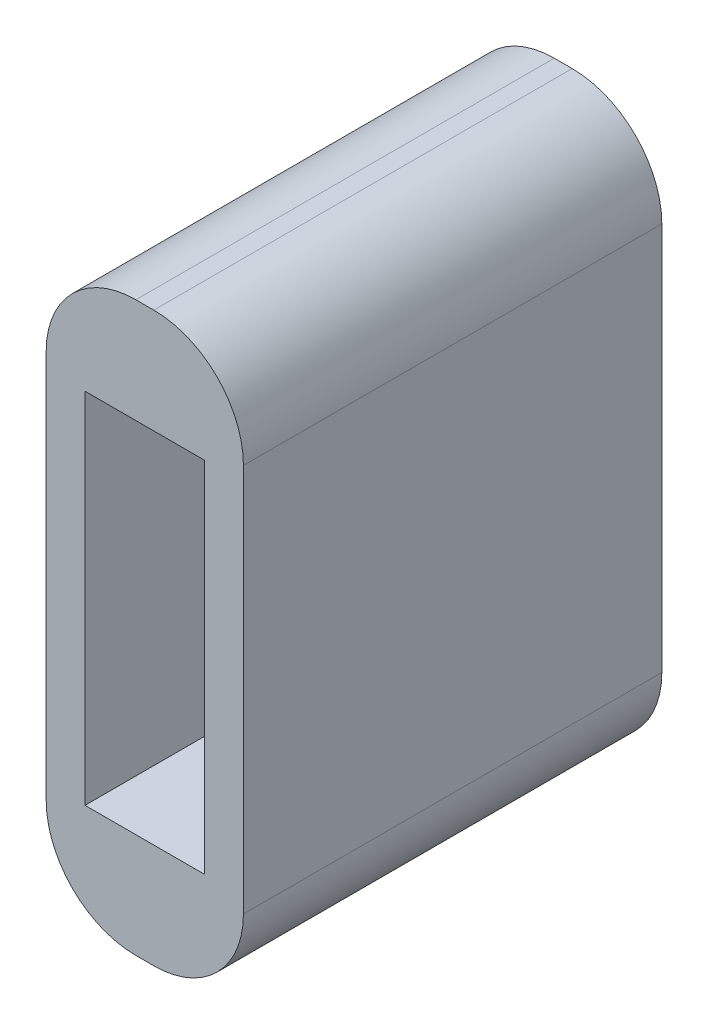
ISO-10303-21;
HEADER;
FILE_DESCRIPTION(('STEP AP214'),'2;1');
FILE_NAME('part.step','',(''),(''),'','','');
FILE_SCHEMA(('AUTOMOTIVE_DESIGN { 1 0 10303 214 1 1 1 1 }'));
ENDSEC;
DATA;
#1=APPLICATION_CONTEXT('core data for automotive mechanical design processes');
#2=APPLICATION_PROTOCOL_DEFINITION('international standard','automotive_design',2000,#1);
#3=PRODUCT_CONTEXT('',#1,'mechanical');
#4=PRODUCT('Part','Part','',(#3));
#5=PRODUCT_RELATED_PRODUCT_CATEGORY('part','',(#4));
#6=PRODUCT_DEFINITION_FORMATION('','',#4);
#7=PRODUCT_DEFINITION_CONTEXT('part definition',#1,'design');
#8=PRODUCT_DEFINITION('design','',#6,#7);
#9=PRODUCT_DEFINITION_SHAPE('','',#8);
#10=(LENGTH_UNIT() NAMED_UNIT(*) SI_UNIT(.MILLI.,.METRE.));
#11=(NAMED_UNIT(*) PLANE_ANGLE_UNIT() SI_UNIT($,.RADIAN.));
#12=(NAMED_UNIT(*) SI_UNIT($,.STERADIAN.) SOLID_ANGLE_UNIT());
#13=UNCERTAINTY_MEASURE_WITH_UNIT(LENGTH_MEASURE(1.E-05),#10,'distance_accuracy_value','');
#14=(GEOMETRIC_REPRESENTATION_CONTEXT(3) GLOBAL_UNCERTAINTY_ASSIGNED_CONTEXT((#13)) GLOBAL_UNIT_ASSIGNED_CONTEXT((#10,
#11,#12)) REPRESENTATION_CONTEXT('',''));
#15=CARTESIAN_POINT('',(0.,0.,0.));
#16=DIRECTION('',(0.,0.,1.));
#17=DIRECTION('',(1.,0.,0.));
#18=AXIS2_PLACEMENT_3D('',#15,#16,#17);
#19=CARTESIAN_POINT('',(1.65,4.75,7.));
#20=DIRECTION('',(-1.,0.,0.));
#21=DIRECTION('',(0.,0.,1.));
#22=AXIS2_PLACEMENT_3D('',#19,#20,#21);
#23=PLANE('',#22);
#24=DIRECTION('',(0.,1.,0.));
#25=VECTOR('',#24,1.);
#26=CARTESIAN_POINT('',(1.65,4.75,7.));
#27=LINE('',#26,#25);
#28=CARTESIAN_POINT('',(1.65,-3.25,7.));
#29=VERTEX_POINT('',#28);
#30=CARTESIAN_POINT('',(1.65,3.25,7.));
#31=VERTEX_POINT('',#30);
#32=EDGE_CURVE('E159',#29,#31,#27,.T.);
#33=ORIENTED_EDGE('',*,*,#32,.F.);
#34=DIRECTION('',(0.,0.,-1.));
#35=VECTOR('',#34,1.);
#36=CARTESIAN_POINT('',(1.65,-3.25,7.));
#37=LINE('',#36,#35);
#38=CARTESIAN_POINT('',(1.65,-3.25,0.));
#39=VERTEX_POINT('',#38);
#40=EDGE_CURVE('E184',#29,#39,#37,.T.);
#41=ORIENTED_EDGE('',*,*,#40,.T.);
#42=DIRECTION('',(0.,1.,0.));
#43=VECTOR('',#42,1.);
#44=CARTESIAN_POINT('',(1.65,4.75,0.));
#45=LINE('',#44,#43);
#46=CARTESIAN_POINT('',(1.65,3.25,0.));
#47=VERTEX_POINT('',#46);
#48=EDGE_CURVE('E155',#39,#47,#45,.T.);
#49=ORIENTED_EDGE('',*,*,#48,.T.);
#50=DIRECTION('',(0.,0.,-1.));
#51=VECTOR('',#50,1.);
#52=CARTESIAN_POINT('',(1.65,3.25,7.));
#53=LINE('',#52,#51);
#54=EDGE_CURVE('E172',#47,#31,#53,.F.);
#55=ORIENTED_EDGE('',*,*,#54,.T.);
#56=EDGE_LOOP('',(#33,#41,#49,#55));
#57=FACE_BOUND('',#56,.T.);
#58=ADVANCED_FACE('F34',(#57),#23,.F.);
#59=CARTESIAN_POINT('',(-1.65,4.75,7.));
#60=DIRECTION('',(0.,-1.,0.));
#61=DIRECTION('',(0.,0.,-1.));
#62=AXIS2_PLACEMENT_3D('',#59,#60,#61);
#63=PLANE('',#62);
#64=DIRECTION('',(-1.,0.,0.));
#65=VECTOR('',#64,1.);
#66=CARTESIAN_POINT('',(-1.65,4.75,0.));
#67=LINE('',#66,#65);
#68=CARTESIAN_POINT('',(0.150000000000001,4.75,0.));
#69=VERTEX_POINT('',#68);
#70=CARTESIAN_POINT('',(-0.150000000000001,4.75,0.));
#71=VERTEX_POINT('',#70);
#72=EDGE_CURVE('E175',#69,#71,#67,.T.);
#73=ORIENTED_EDGE('',*,*,#72,.T.);
#74=DIRECTION('',(0.,0.,-1.));
#75=VECTOR('',#74,1.);
#76=CARTESIAN_POINT('',(-0.150000000000001,4.75,7.));
#77=LINE('',#76,#75);
#78=CARTESIAN_POINT('',(-0.150000000000001,4.75,7.));
#79=VERTEX_POINT('',#78);
#80=EDGE_CURVE('E11',#71,#79,#77,.F.);
#81=ORIENTED_EDGE('',*,*,#80,.T.);
#82=DIRECTION('',(-1.,0.,0.));
#83=VECTOR('',#82,1.);
#84=CARTESIAN_POINT('',(-1.65,4.75,7.));
#85=LINE('',#84,#83);
#86=CARTESIAN_POINT('',(0.150000000000001,4.75,7.));
#87=VERTEX_POINT('',#86);
#88=EDGE_CURVE('E162',#87,#79,#85,.T.);
#89=ORIENTED_EDGE('',*,*,#88,.F.);
#90=DIRECTION('',(0.,0.,-1.));
#91=VECTOR('',#90,1.);
#92=CARTESIAN_POINT('',(0.150000000000001,4.75,7.));
#93=LINE('',#92,#91);
#94=EDGE_CURVE('E42',#87,#69,#93,.T.);
#95=ORIENTED_EDGE('',*,*,#94,.T.);
#96=EDGE_LOOP('',(#73,#81,#89,#95));
#97=FACE_BOUND('',#96,.T.);
#98=ADVANCED_FACE('F217',(#97),#63,.F.);
#99=CARTESIAN_POINT('',(-1.65,4.75,7.));
#100=DIRECTION('',(1.,0.,0.));
#101=DIRECTION('',(0.,0.,-1.));
#102=AXIS2_PLACEMENT_3D('',#99,#100,#101);
#103=PLANE('',#102);
#104=DIRECTION('',(0.,-1.,0.));
#105=VECTOR('',#104,1.);
#106=CARTESIAN_POINT('',(-1.65,4.75,0.));
#107=LINE('',#106,#105);
#108=CARTESIAN_POINT('',(-1.65,3.25,0.));
#109=VERTEX_POINT('',#108);
#110=CARTESIAN_POINT('',(-1.65,-3.25,0.));
#111=VERTEX_POINT('',#110);
#112=EDGE_CURVE('E178',#109,#111,#107,.T.);
#113=ORIENTED_EDGE('',*,*,#112,.T.);
#114=DIRECTION('',(0.,0.,-1.));
#115=VECTOR('',#114,1.);
#116=CARTESIAN_POINT('',(-1.65,-3.25,7.));
#117=LINE('',#116,#115);
#118=CARTESIAN_POINT('',(-1.65,-3.25,7.));
#119=VERTEX_POINT('',#118);
#120=EDGE_CURVE('E211',#111,#119,#117,.F.);
#121=ORIENTED_EDGE('',*,*,#120,.T.);
#122=DIRECTION('',(0.,-1.,0.));
#123=VECTOR('',#122,1.);
#124=CARTESIAN_POINT('',(-1.65,4.75,7.));
#125=LINE('',#124,#123);
#126=CARTESIAN_POINT('',(-1.65,3.25,7.));
#127=VERTEX_POINT('',#126);
#128=EDGE_CURVE('E166',#127,#119,#125,.T.);
#129=ORIENTED_EDGE('',*,*,#128,.F.);
#130=DIRECTION('',(0.,0.,-1.));
#131=VECTOR('',#130,1.);
#132=CARTESIAN_POINT('',(-1.65,3.25,7.));
#133=LINE('',#132,#131);
#134=EDGE_CURVE('E208',#127,#109,#133,.T.);
#135=ORIENTED_EDGE('',*,*,#134,.T.);
#136=EDGE_LOOP('',(#113,#121,#129,#135));
#137=FACE_BOUND('',#136,.T.);
#138=ADVANCED_FACE('F229',(#137),#103,.F.);
#139=CARTESIAN_POINT('',(-1.65,-4.75,7.));
#140=DIRECTION('',(0.,1.,0.));
#141=DIRECTION('',(0.,0.,1.));
#142=AXIS2_PLACEMENT_3D('',#139,#140,#141);
#143=PLANE('',#142);
#144=DIRECTION('',(1.,0.,0.));
#145=VECTOR('',#144,1.);
#146=CARTESIAN_POINT('',(-1.65,-4.75,0.));
#147=LINE('',#146,#145);
#148=CARTESIAN_POINT('',(-0.150000000000001,-4.75,0.));
#149=VERTEX_POINT('',#148);
#150=CARTESIAN_POINT('',(0.150000000000001,-4.75,0.));
#151=VERTEX_POINT('',#150);
#152=EDGE_CURVE('E163',#149,#151,#147,.T.);
#153=ORIENTED_EDGE('',*,*,#152,.T.);
#154=DIRECTION('',(0.,0.,-1.));
#155=VECTOR('',#154,1.);
#156=CARTESIAN_POINT('',(0.150000000000001,-4.75,7.));
#157=LINE('',#156,#155);
#158=CARTESIAN_POINT('',(0.150000000000001,-4.75,7.));
#159=VERTEX_POINT('',#158);
#160=EDGE_CURVE('E198',#151,#159,#157,.F.);
#161=ORIENTED_EDGE('',*,*,#160,.T.);
#162=DIRECTION('',(1.,0.,0.));
#163=VECTOR('',#162,1.);
#164=CARTESIAN_POINT('',(-1.65,-4.75,7.));
#165=LINE('',#164,#163);
#166=CARTESIAN_POINT('',(-0.150000000000001,-4.75,7.));
#167=VERTEX_POINT('',#166);
#168=EDGE_CURVE('E169',#167,#159,#165,.T.);
#169=ORIENTED_EDGE('',*,*,#168,.F.);
#170=DIRECTION('',(0.,0.,-1.));
#171=VECTOR('',#170,1.);
#172=CARTESIAN_POINT('',(-0.150000000000001,-4.75,7.));
#173=LINE('',#172,#171);
#174=EDGE_CURVE('E195',#167,#149,#173,.T.);
#175=ORIENTED_EDGE('',*,*,#174,.T.);
#176=EDGE_LOOP('',(#153,#161,#169,#175));
#177=FACE_BOUND('',#176,.T.);
#178=ADVANCED_FACE('F240',(#177),#143,.F.);
#179=CARTESIAN_POINT('',(0.,0.,7.));
#180=DIRECTION('',(0.,0.,1.));
#181=DIRECTION('',(1.,0.,0.));
#182=AXIS2_PLACEMENT_3D('',#179,#180,#181);
#183=PLANE('',#182);
#184=DIRECTION('',(0.,1.,0.));
#185=VECTOR('',#184,1.);
#186=CARTESIAN_POINT('',(1.,3.,7.));
#187=LINE('',#186,#185);
#188=CARTESIAN_POINT('',(1.,-3.,7.));
#189=VERTEX_POINT('',#188);
#190=CARTESIAN_POINT('',(1.,3.,7.));
#191=VERTEX_POINT('',#190);
#192=EDGE_CURVE('E49',#189,#191,#187,.T.);
#193=ORIENTED_EDGE('',*,*,#192,.F.);
#194=DIRECTION('',(1.,0.,0.));
#195=VECTOR('',#194,1.);
#196=CARTESIAN_POINT('',(-1.,-3.,7.));
#197=LINE('',#196,#195);
#198=CARTESIAN_POINT('',(-1.,-3.,7.));
#199=VERTEX_POINT('',#198);
#200=EDGE_CURVE('E140',#199,#189,#197,.T.);
#201=ORIENTED_EDGE('',*,*,#200,.F.);
#202=DIRECTION('',(0.,-1.,0.));
#203=VECTOR('',#202,1.);
#204=CARTESIAN_POINT('',(-1.,3.,7.));
#205=LINE('',#204,#203);
#206=CARTESIAN_POINT('',(-1.,3.,7.));
#207=VERTEX_POINT('',#206);
#208=EDGE_CURVE('E143',#207,#199,#205,.T.);
#209=ORIENTED_EDGE('',*,*,#208,.F.);
#210=DIRECTION('',(-1.,0.,0.));
#211=VECTOR('',#210,1.);
#212=CARTESIAN_POINT('',(-1.,3.,7.));
#213=LINE('',#212,#211);
#214=EDGE_CURVE('E149',#191,#207,#213,.T.);
#215=ORIENTED_EDGE('',*,*,#214,.F.);
#216=EDGE_LOOP('',(#193,#201,#209,#215));
#217=FACE_BOUND('',#216,.T.);
#218=ORIENTED_EDGE('',*,*,#168,.T.);
#219=CARTESIAN_POINT('',(0.150000000000001,-3.25,7.));
#220=DIRECTION('',(0.,0.,1.));
#221=DIRECTION('',(1.,0.,0.));
#222=AXIS2_PLACEMENT_3D('',#219,#220,#221);
#223=CIRCLE('',#222,1.5);
#224=EDGE_CURVE('E206',#159,#29,#223,.T.);
#225=ORIENTED_EDGE('',*,*,#224,.T.);
#226=ORIENTED_EDGE('',*,*,#32,.T.);
#227=CARTESIAN_POINT('',(0.150000000000001,3.25,7.));
#228=DIRECTION('',(0.,0.,1.));
#229=DIRECTION('',(1.,0.,0.));
#230=AXIS2_PLACEMENT_3D('',#227,#228,#229);
#231=CIRCLE('',#230,1.5);
#232=EDGE_CURVE('E200',#31,#87,#231,.T.);
#233=ORIENTED_EDGE('',*,*,#232,.T.);
#234=ORIENTED_EDGE('',*,*,#88,.T.);
#235=CARTESIAN_POINT('',(-0.150000000000001,3.25,7.));
#236=DIRECTION('',(0.,0.,1.));
#237=DIRECTION('',(1.,0.,0.));
#238=AXIS2_PLACEMENT_3D('',#235,#236,#237);
#239=CIRCLE('',#238,1.5);
#240=EDGE_CURVE('E202',#79,#127,#239,.T.);
#241=ORIENTED_EDGE('',*,*,#240,.T.);
#242=ORIENTED_EDGE('',*,*,#128,.T.);
#243=CARTESIAN_POINT('',(-0.150000000000001,-3.25,7.));
#244=DIRECTION('',(0.,0.,1.));
#245=DIRECTION('',(1.,0.,0.));
#246=AXIS2_PLACEMENT_3D('',#243,#244,#245);
#247=CIRCLE('',#246,1.5);
#248=EDGE_CURVE('E204',#119,#167,#247,.T.);
#249=ORIENTED_EDGE('',*,*,#248,.T.);
#250=EDGE_LOOP('',(#218,#225,#226,#233,#234,#241,#242,#249));
#251=FACE_BOUND('',#250,.T.);
#252=ADVANCED_FACE('F233',(#217,#251),#183,.T.);
#253=CARTESIAN_POINT('',(0.,0.,0.));
#254=DIRECTION('',(0.,0.,1.));
#255=DIRECTION('',(1.,0.,0.));
#256=AXIS2_PLACEMENT_3D('',#253,#254,#255);
#257=PLANE('',#256);
#258=DIRECTION('',(1.,0.,0.));
#259=VECTOR('',#258,1.);
#260=CARTESIAN_POINT('',(-1.,-3.,0.));
#261=LINE('',#260,#259);
#262=CARTESIAN_POINT('',(-1.,-3.,0.));
#263=VERTEX_POINT('',#262);
#264=CARTESIAN_POINT('',(1.,-3.,0.));
#265=VERTEX_POINT('',#264);
#266=EDGE_CURVE('E130',#263,#265,#261,.T.);
#267=ORIENTED_EDGE('',*,*,#266,.T.);
#268=DIRECTION('',(0.,1.,0.));
#269=VECTOR('',#268,1.);
#270=CARTESIAN_POINT('',(1.,3.,0.));
#271=LINE('',#270,#269);
#272=CARTESIAN_POINT('',(1.,3.,0.));
#273=VERTEX_POINT('',#272);
#274=EDGE_CURVE('E124',#265,#273,#271,.T.);
#275=ORIENTED_EDGE('',*,*,#274,.T.);
#276=DIRECTION('',(-1.,0.,0.));
#277=VECTOR('',#276,1.);
#278=CARTESIAN_POINT('',(-1.,3.,0.));
#279=LINE('',#278,#277);
#280=CARTESIAN_POINT('',(-1.,3.,0.));
#281=VERTEX_POINT('',#280);
#282=EDGE_CURVE('E133',#273,#281,#279,.T.);
#283=ORIENTED_EDGE('',*,*,#282,.T.);
#284=DIRECTION('',(0.,-1.,0.));
#285=VECTOR('',#284,1.);
#286=CARTESIAN_POINT('',(-1.,3.,0.));
#287=LINE('',#286,#285);
#288=EDGE_CURVE('E57',#281,#263,#287,.T.);
#289=ORIENTED_EDGE('',*,*,#288,.T.);
#290=EDGE_LOOP('',(#267,#275,#283,#289));
#291=FACE_BOUND('',#290,.T.);
#292=ORIENTED_EDGE('',*,*,#48,.F.);
#293=CARTESIAN_POINT('',(0.150000000000001,-3.25,0.));
#294=DIRECTION('',(0.,0.,1.));
#295=DIRECTION('',(1.,0.,0.));
#296=AXIS2_PLACEMENT_3D('',#293,#294,#295);
#297=CIRCLE('',#296,1.5);
#298=EDGE_CURVE('E193',#39,#151,#297,.F.);
#299=ORIENTED_EDGE('',*,*,#298,.T.);
#300=ORIENTED_EDGE('',*,*,#152,.F.);
#301=CARTESIAN_POINT('',(-0.150000000000001,-3.25,0.));
#302=DIRECTION('',(0.,0.,1.));
#303=DIRECTION('',(1.,0.,0.));
#304=AXIS2_PLACEMENT_3D('',#301,#302,#303);
#305=CIRCLE('',#304,1.5);
#306=EDGE_CURVE('E191',#149,#111,#305,.F.);
#307=ORIENTED_EDGE('',*,*,#306,.T.);
#308=ORIENTED_EDGE('',*,*,#112,.F.);
#309=CARTESIAN_POINT('',(-0.150000000000001,3.25,0.));
#310=DIRECTION('',(0.,0.,1.));
#311=DIRECTION('',(1.,0.,0.));
#312=AXIS2_PLACEMENT_3D('',#309,#310,#311);
#313=CIRCLE('',#312,1.5);
#314=EDGE_CURVE('E189',#109,#71,#313,.F.);
#315=ORIENTED_EDGE('',*,*,#314,.T.);
#316=ORIENTED_EDGE('',*,*,#72,.F.);
#317=CARTESIAN_POINT('',(0.150000000000001,3.25,0.));
#318=DIRECTION('',(0.,0.,1.));
#319=DIRECTION('',(1.,0.,0.));
#320=AXIS2_PLACEMENT_3D('',#317,#318,#319);
#321=CIRCLE('',#320,1.5);
#322=EDGE_CURVE('E187',#69,#47,#321,.F.);
#323=ORIENTED_EDGE('',*,*,#322,.T.);
#324=EDGE_LOOP('',(#292,#299,#300,#307,#308,#315,#316,#323));
#325=FACE_BOUND('',#324,.T.);
#326=ADVANCED_FACE('F137',(#291,#325),#257,.F.);
#327=CARTESIAN_POINT('',(0.150000000000001,-3.25,7.));
#328=DIRECTION('',(0.,0.,-1.));
#329=DIRECTION('',(-1.,0.,0.));
#330=AXIS2_PLACEMENT_3D('',#327,#328,#329);
#331=CYLINDRICAL_SURFACE('',#330,1.5);
#332=ORIENTED_EDGE('',*,*,#224,.F.);
#333=ORIENTED_EDGE('',*,*,#160,.F.);
#334=ORIENTED_EDGE('',*,*,#298,.F.);
#335=ORIENTED_EDGE('',*,*,#40,.F.);
#336=EDGE_LOOP('',(#332,#333,#334,#335));
#337=FACE_BOUND('',#336,.T.);
#338=ADVANCED_FACE('F245',(#337),#331,.T.);
#339=CARTESIAN_POINT('',(-0.150000000000001,-3.25,7.));
#340=DIRECTION('',(0.,0.,-1.));
#341=DIRECTION('',(-1.,0.,0.));
#342=AXIS2_PLACEMENT_3D('',#339,#340,#341);
#343=CYLINDRICAL_SURFACE('',#342,1.5);
#344=ORIENTED_EDGE('',*,*,#248,.F.);
#345=ORIENTED_EDGE('',*,*,#120,.F.);
#346=ORIENTED_EDGE('',*,*,#306,.F.);
#347=ORIENTED_EDGE('',*,*,#174,.F.);
#348=EDGE_LOOP('',(#344,#345,#346,#347));
#349=FACE_BOUND('',#348,.T.);
#350=ADVANCED_FACE('F237',(#349),#343,.T.);
#351=CARTESIAN_POINT('',(-0.150000000000001,3.25,7.));
#352=DIRECTION('',(0.,0.,-1.));
#353=DIRECTION('',(-1.,0.,0.));
#354=AXIS2_PLACEMENT_3D('',#351,#352,#353);
#355=CYLINDRICAL_SURFACE('',#354,1.5);
#356=ORIENTED_EDGE('',*,*,#240,.F.);
#357=ORIENTED_EDGE('',*,*,#80,.F.);
#358=ORIENTED_EDGE('',*,*,#314,.F.);
#359=ORIENTED_EDGE('',*,*,#134,.F.);
#360=EDGE_LOOP('',(#356,#357,#358,#359));
#361=FACE_BOUND('',#360,.T.);
#362=ADVANCED_FACE('F226',(#361),#355,.T.);
#363=CARTESIAN_POINT('',(0.150000000000001,3.25,7.));
#364=DIRECTION('',(0.,0.,-1.));
#365=DIRECTION('',(-1.,0.,0.));
#366=AXIS2_PLACEMENT_3D('',#363,#364,#365);
#367=CYLINDRICAL_SURFACE('',#366,1.5);
#368=ORIENTED_EDGE('',*,*,#232,.F.);
#369=ORIENTED_EDGE('',*,*,#54,.F.);
#370=ORIENTED_EDGE('',*,*,#322,.F.);
#371=ORIENTED_EDGE('',*,*,#94,.F.);
#372=EDGE_LOOP('',(#368,#369,#370,#371));
#373=FACE_BOUND('',#372,.T.);
#374=ADVANCED_FACE('F36',(#373),#367,.T.);
#375=CARTESIAN_POINT('',(1.,3.,0.));
#376=DIRECTION('',(1.,0.,0.));
#377=DIRECTION('',(0.,0.,-1.));
#378=AXIS2_PLACEMENT_3D('',#375,#376,#377);
#379=PLANE('',#378);
#380=ORIENTED_EDGE('',*,*,#192,.T.);
#381=DIRECTION('',(0.,0.,1.));
#382=VECTOR('',#381,1.);
#383=CARTESIAN_POINT('',(1.,3.,0.));
#384=LINE('',#383,#382);
#385=EDGE_CURVE('E120',#273,#191,#384,.T.);
#386=ORIENTED_EDGE('',*,*,#385,.F.);
#387=ORIENTED_EDGE('',*,*,#274,.F.);
#388=DIRECTION('',(0.,0.,1.));
#389=VECTOR('',#388,1.);
#390=CARTESIAN_POINT('',(1.,-3.,0.));
#391=LINE('',#390,#389);
#392=EDGE_CURVE('E153',#265,#189,#391,.T.);
#393=ORIENTED_EDGE('',*,*,#392,.T.);
#394=EDGE_LOOP('',(#380,#386,#387,#393));
#395=FACE_BOUND('',#394,.T.);
#396=ADVANCED_FACE('F122',(#395),#379,.F.);
#397=CARTESIAN_POINT('',(-1.,-3.,0.));
#398=DIRECTION('',(0.,-1.,0.));
#399=DIRECTION('',(0.,0.,-1.));
#400=AXIS2_PLACEMENT_3D('',#397,#398,#399);
#401=PLANE('',#400);
#402=ORIENTED_EDGE('',*,*,#200,.T.);
#403=ORIENTED_EDGE('',*,*,#392,.F.);
#404=ORIENTED_EDGE('',*,*,#266,.F.);
#405=DIRECTION('',(0.,0.,1.));
#406=VECTOR('',#405,1.);
#407=CARTESIAN_POINT('',(-1.,-3.,0.));
#408=LINE('',#407,#406);
#409=EDGE_CURVE('E156',#263,#199,#408,.T.);
#410=ORIENTED_EDGE('',*,*,#409,.T.);
#411=EDGE_LOOP('',(#402,#403,#404,#410));
#412=FACE_BOUND('',#411,.T.);
#413=ADVANCED_FACE('F254',(#412),#401,.F.);
#414=CARTESIAN_POINT('',(-1.,3.,0.));
#415=DIRECTION('',(-1.,0.,0.));
#416=DIRECTION('',(0.,0.,1.));
#417=AXIS2_PLACEMENT_3D('',#414,#415,#416);
#418=PLANE('',#417);
#419=ORIENTED_EDGE('',*,*,#208,.T.);
#420=ORIENTED_EDGE('',*,*,#409,.F.);
#421=ORIENTED_EDGE('',*,*,#288,.F.);
#422=DIRECTION('',(0.,0.,1.));
#423=VECTOR('',#422,1.);
#424=CARTESIAN_POINT('',(-1.,3.,0.));
#425=LINE('',#424,#423);
#426=EDGE_CURVE('E129',#281,#207,#425,.T.);
#427=ORIENTED_EDGE('',*,*,#426,.T.);
#428=EDGE_LOOP('',(#419,#420,#421,#427));
#429=FACE_BOUND('',#428,.T.);
#430=ADVANCED_FACE('F314',(#429),#418,.F.);
#431=CARTESIAN_POINT('',(-1.,3.,0.));
#432=DIRECTION('',(0.,1.,0.));
#433=DIRECTION('',(0.,0.,1.));
#434=AXIS2_PLACEMENT_3D('',#431,#432,#433);
#435=PLANE('',#434);
#436=ORIENTED_EDGE('',*,*,#214,.T.);
#437=ORIENTED_EDGE('',*,*,#426,.F.);
#438=ORIENTED_EDGE('',*,*,#282,.F.);
#439=ORIENTED_EDGE('',*,*,#385,.T.);
#440=EDGE_LOOP('',(#436,#437,#438,#439));
#441=FACE_BOUND('',#440,.T.);
#442=ADVANCED_FACE('F134',(#441),#435,.F.);
#443=CLOSED_SHELL('',(#58,#98,#138,#178,#252,#326,#338,#350,#362,#374,#396,#413,#430,#442));
#444=MANIFOLD_SOLID_BREP('B2',#443);
#445=ADVANCED_BREP_SHAPE_REPRESENTATION('',(#18,#444),#14);
#446=SHAPE_DEFINITION_REPRESENTATION(#9,#445);
ENDSEC;
END-ISO-10303-21;
